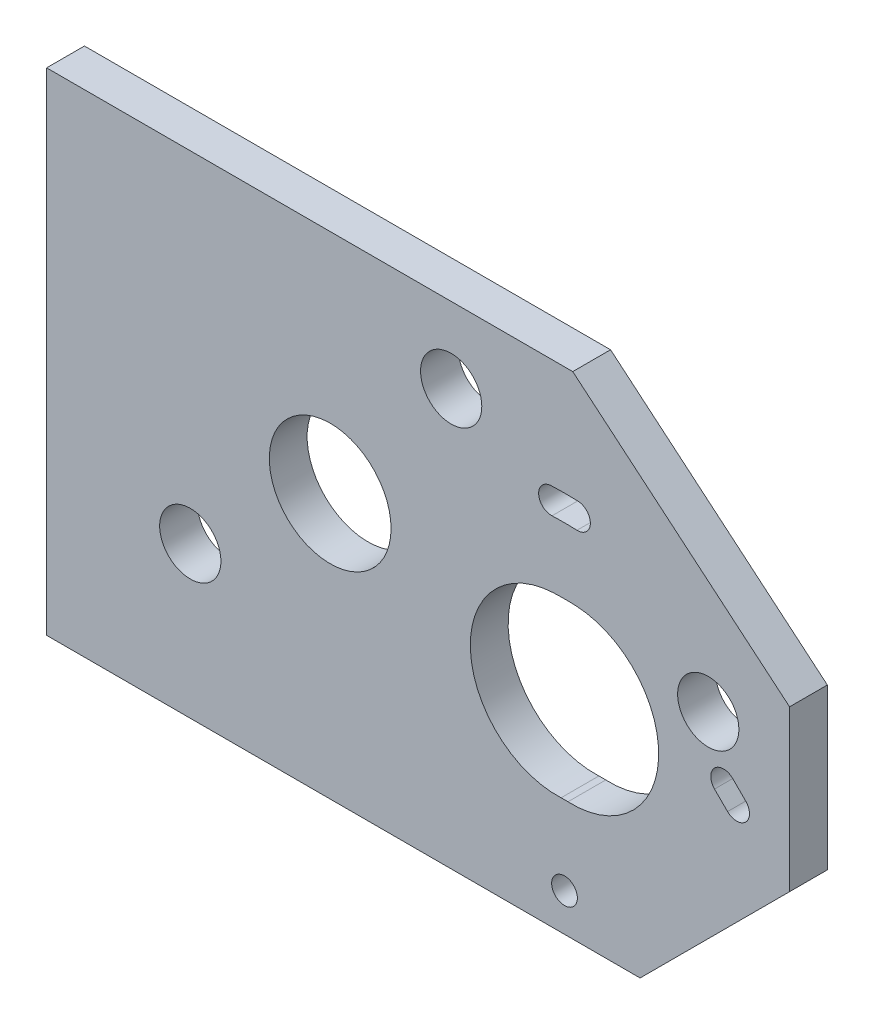
ISO-10303-21;
HEADER;
FILE_DESCRIPTION(('STEP AP214'),'2;1');
FILE_NAME('part.step','',(''),(''),'','','');
FILE_SCHEMA(('AUTOMOTIVE_DESIGN { 1 0 10303 214 1 1 1 1 }'));
ENDSEC;
DATA;
#1=APPLICATION_CONTEXT('core data for automotive mechanical design processes');
#2=APPLICATION_PROTOCOL_DEFINITION('international standard','automotive_design',2000,#1);
#3=PRODUCT_CONTEXT('',#1,'mechanical');
#4=PRODUCT('Part','Part','',(#3));
#5=PRODUCT_RELATED_PRODUCT_CATEGORY('part','',(#4));
#6=PRODUCT_DEFINITION_FORMATION('','',#4);
#7=PRODUCT_DEFINITION_CONTEXT('part definition',#1,'design');
#8=PRODUCT_DEFINITION('design','',#6,#7);
#9=PRODUCT_DEFINITION_SHAPE('','',#8);
#10=(LENGTH_UNIT() NAMED_UNIT(*) SI_UNIT(.MILLI.,.METRE.));
#11=(NAMED_UNIT(*) PLANE_ANGLE_UNIT() SI_UNIT($,.RADIAN.));
#12=(NAMED_UNIT(*) SI_UNIT($,.STERADIAN.) SOLID_ANGLE_UNIT());
#13=UNCERTAINTY_MEASURE_WITH_UNIT(LENGTH_MEASURE(1.E-05),#10,'distance_accuracy_value','');
#14=(GEOMETRIC_REPRESENTATION_CONTEXT(3) GLOBAL_UNCERTAINTY_ASSIGNED_CONTEXT((#13)) GLOBAL_UNIT_ASSIGNED_CONTEXT((#10,
#11,#12)) REPRESENTATION_CONTEXT('',''));
#15=CARTESIAN_POINT('',(0.,0.,0.));
#16=DIRECTION('',(0.,0.,1.));
#17=DIRECTION('',(1.,0.,0.));
#18=AXIS2_PLACEMENT_3D('',#15,#16,#17);
#19=CARTESIAN_POINT('',(0.,0.,5.));
#20=DIRECTION('',(0.,0.,-1.));
#21=DIRECTION('',(-1.,0.,0.));
#22=AXIS2_PLACEMENT_3D('',#19,#20,#21);
#23=PLANE('',#22);
#24=CARTESIAN_POINT('',(0.,0.,5.));
#25=DIRECTION('',(0.,0.,1.));
#26=DIRECTION('',(1.,0.,0.));
#27=AXIS2_PLACEMENT_3D('',#24,#25,#26);
#28=CIRCLE('',#27,8.05);
#29=CARTESIAN_POINT('',(8.05,0.,5.));
#30=VERTEX_POINT('',#29);
#31=EDGE_CURVE('E194',#30,#30,#28,.T.);
#32=ORIENTED_EDGE('',*,*,#31,.F.);
#33=EDGE_LOOP('',(#32));
#34=FACE_BOUND('',#33,.T.);
#35=CARTESIAN_POINT('',(30.987000641398,-30.,5.));
#36=DIRECTION('',(0.,0.,1.));
#37=DIRECTION('',(1.,0.,0.));
#38=AXIS2_PLACEMENT_3D('',#35,#36,#37);
#39=CIRCLE('',#38,1.69999999999998);
#40=CARTESIAN_POINT('',(32.687000641398,-30.,5.));
#41=VERTEX_POINT('',#40);
#42=EDGE_CURVE('E200',#41,#41,#39,.T.);
#43=ORIENTED_EDGE('',*,*,#42,.F.);
#44=EDGE_LOOP('',(#43));
#45=FACE_BOUND('',#44,.T.);
#46=CARTESIAN_POINT('',(29.2658110587049,13.8072001778298,5.));
#47=DIRECTION('',(0.,0.,1.));
#48=DIRECTION('',(1.,0.,0.));
#49=AXIS2_PLACEMENT_3D('',#46,#47,#48);
#50=CIRCLE('',#49,1.7);
#51=CARTESIAN_POINT('',(29.1990693719145,15.505889539439,5.));
#52=VERTEX_POINT('',#51);
#53=CARTESIAN_POINT('',(29.3325527454953,12.1085108162206,5.));
#54=VERTEX_POINT('',#53);
#55=EDGE_CURVE('E206',#52,#54,#50,.T.);
#56=ORIENTED_EDGE('',*,*,#55,.F.);
#57=CARTESIAN_POINT('',(30.987000641398,-30.,5.));
#58=DIRECTION('',(0.,0.,1.));
#59=DIRECTION('',(-1.,0.,0.));
#60=AXIS2_PLACEMENT_3D('',#57,#58,#59);
#61=CIRCLE('',#60,45.5410000000003);
#62=CARTESIAN_POINT('',(32.7749319108815,15.505889539439,5.));
#63=VERTEX_POINT('',#62);
#64=EDGE_CURVE('E214',#63,#52,#61,.T.);
#65=ORIENTED_EDGE('',*,*,#64,.F.);
#66=CARTESIAN_POINT('',(32.7081902240911,13.8072001778298,5.));
#67=DIRECTION('',(0.,0.,1.));
#68=DIRECTION('',(-1.,0.,0.));
#69=AXIS2_PLACEMENT_3D('',#66,#67,#68);
#70=CIRCLE('',#69,1.7);
#71=CARTESIAN_POINT('',(32.6414485373007,12.1085108162206,5.));
#72=VERTEX_POINT('',#71);
#73=EDGE_CURVE('E211',#72,#63,#70,.T.);
#74=ORIENTED_EDGE('',*,*,#73,.F.);
#75=CARTESIAN_POINT('',(30.987000641398,-30.,5.));
#76=DIRECTION('',(0.,0.,-1.));
#77=DIRECTION('',(-1.,0.,0.));
#78=AXIS2_PLACEMENT_3D('',#75,#76,#77);
#79=CIRCLE('',#78,42.1410000000002);
#80=EDGE_CURVE('E208',#54,#72,#79,.T.);
#81=ORIENTED_EDGE('',*,*,#80,.F.);
#82=EDGE_LOOP('',(#56,#65,#74,#81));
#83=FACE_BOUND('',#82,.T.);
#84=CARTESIAN_POINT('',(-18.5,-15.,5.));
#85=DIRECTION('',(0.,0.,1.));
#86=DIRECTION('',(1.,0.,0.));
#87=AXIS2_PLACEMENT_3D('',#84,#85,#86);
#88=CIRCLE('',#87,4.05);
#89=CARTESIAN_POINT('',(-14.45,-15.,5.));
#90=VERTEX_POINT('',#89);
#91=EDGE_CURVE('E268',#90,#90,#88,.T.);
#92=ORIENTED_EDGE('',*,*,#91,.F.);
#93=EDGE_LOOP('',(#92));
#94=FACE_BOUND('',#93,.T.);
#95=CARTESIAN_POINT('',(50.,0.,5.));
#96=DIRECTION('',(0.,0.,1.));
#97=DIRECTION('',(1.,0.,0.));
#98=AXIS2_PLACEMENT_3D('',#95,#96,#97);
#99=CIRCLE('',#98,4.05);
#100=CARTESIAN_POINT('',(54.05,0.,5.));
#101=VERTEX_POINT('',#100);
#102=EDGE_CURVE('E274',#101,#101,#99,.T.);
#103=ORIENTED_EDGE('',*,*,#102,.F.);
#104=EDGE_LOOP('',(#103));
#105=FACE_BOUND('',#104,.T.);
#106=CARTESIAN_POINT('',(16.,20.,5.));
#107=DIRECTION('',(0.,0.,1.));
#108=DIRECTION('',(1.,0.,0.));
#109=AXIS2_PLACEMENT_3D('',#106,#107,#108);
#110=CIRCLE('',#109,4.04999999999999);
#111=CARTESIAN_POINT('',(20.05,20.,5.));
#112=VERTEX_POINT('',#111);
#113=EDGE_CURVE('E280',#112,#112,#110,.T.);
#114=ORIENTED_EDGE('',*,*,#113,.F.);
#115=EDGE_LOOP('',(#114));
#116=FACE_BOUND('',#115,.T.);
#117=DIRECTION('',(-0.766044443118977,0.64278760968654,0.));
#118=VECTOR('',#117,1.);
#119=CARTESIAN_POINT('',(60.7512091401484,5.94120082025597,5.));
#120=LINE('',#119,#118);
#121=CARTESIAN_POINT('',(60.7512091401484,5.94120082025597,5.));
#122=VERTEX_POINT('',#121);
#123=CARTESIAN_POINT('',(32.0790487841859,30.,5.));
#124=VERTEX_POINT('',#123);
#125=EDGE_CURVE('E286',#122,#124,#120,.T.);
#126=ORIENTED_EDGE('',*,*,#125,.T.);
#127=DIRECTION('',(-1.,0.,0.));
#128=VECTOR('',#127,1.);
#129=CARTESIAN_POINT('',(32.0790487841859,30.,5.));
#130=LINE('',#129,#128);
#131=CARTESIAN_POINT('',(-37.5,30.,5.));
#132=VERTEX_POINT('',#131);
#133=EDGE_CURVE('E289',#124,#132,#130,.T.);
#134=ORIENTED_EDGE('',*,*,#133,.T.);
#135=DIRECTION('',(0.,-1.,0.));
#136=VECTOR('',#135,1.);
#137=CARTESIAN_POINT('',(-37.5,30.,5.));
#138=LINE('',#137,#136);
#139=CARTESIAN_POINT('',(-37.5,-35.,5.));
#140=VERTEX_POINT('',#139);
#141=EDGE_CURVE('E292',#132,#140,#138,.T.);
#142=ORIENTED_EDGE('',*,*,#141,.T.);
#143=DIRECTION('',(1.,0.,0.));
#144=VECTOR('',#143,1.);
#145=CARTESIAN_POINT('',(-37.5,-35.,5.));
#146=LINE('',#145,#144);
#147=CARTESIAN_POINT('',(40.987000641398,-35.,5.));
#148=VERTEX_POINT('',#147);
#149=EDGE_CURVE('E294',#140,#148,#146,.T.);
#150=ORIENTED_EDGE('',*,*,#149,.T.);
#151=DIRECTION('',(0.707106781186549,0.707106781186546,0.));
#152=VECTOR('',#151,1.);
#153=CARTESIAN_POINT('',(40.987000641398,-35.,5.));
#154=LINE('',#153,#152);
#155=CARTESIAN_POINT('',(60.7512091401484,-15.2357915012497,5.));
#156=VERTEX_POINT('',#155);
#157=EDGE_CURVE('E296',#148,#156,#154,.T.);
#158=ORIENTED_EDGE('',*,*,#157,.T.);
#159=DIRECTION('',(0.,1.,0.));
#160=VECTOR('',#159,1.);
#161=CARTESIAN_POINT('',(60.7512091401484,-15.2357915012497,5.));
#162=LINE('',#161,#160);
#163=EDGE_CURVE('E298',#156,#122,#162,.T.);
#164=ORIENTED_EDGE('',*,*,#163,.T.);
#165=EDGE_LOOP('',(#126,#134,#142,#150,#158,#164));
#166=FACE_BOUND('',#165,.T.);
#167=CARTESIAN_POINT('',(52.0297648200216,-7.23433528484822,5.));
#168=DIRECTION('',(0.,0.,1.));
#169=DIRECTION('',(-1.,0.,0.));
#170=AXIS2_PLACEMENT_3D('',#167,#168,#169);
#171=CIRCLE('',#170,1.7);
#172=CARTESIAN_POINT('',(53.2312289521742,-6.03163667790187,5.));
#173=VERTEX_POINT('',#172);
#174=CARTESIAN_POINT('',(50.8283006878689,-8.43703389179455,5.));
#175=VERTEX_POINT('',#174);
#176=EDGE_CURVE('E237',#173,#175,#171,.T.);
#177=ORIENTED_EDGE('',*,*,#176,.F.);
#178=DIRECTION('',(-0.707469768791964,0.706743607148621,0.));
#179=VECTOR('',#178,1.);
#180=CARTESIAN_POINT('',(53.2312289521742,-6.03163667790187,5.));
#181=LINE('',#180,#179);
#182=CARTESIAN_POINT('',(54.952673272301,-7.7513140718764,5.));
#183=VERTEX_POINT('',#182);
#184=EDGE_CURVE('E245',#183,#173,#181,.T.);
#185=ORIENTED_EDGE('',*,*,#184,.F.);
#186=CARTESIAN_POINT('',(53.7512091401484,-8.95401267882274,5.));
#187=DIRECTION('',(0.,0.,1.));
#188=DIRECTION('',(1.,0.,0.));
#189=AXIS2_PLACEMENT_3D('',#186,#187,#188);
#190=CIRCLE('',#189,1.7);
#191=CARTESIAN_POINT('',(52.5497450079957,-10.1567112857691,5.));
#192=VERTEX_POINT('',#191);
#193=EDGE_CURVE('E242',#192,#183,#190,.T.);
#194=ORIENTED_EDGE('',*,*,#193,.F.);
#195=DIRECTION('',(0.707469768791964,-0.706743607148621,0.));
#196=VECTOR('',#195,1.);
#197=CARTESIAN_POINT('',(52.5497450079957,-10.1567112857691,5.));
#198=LINE('',#197,#196);
#199=EDGE_CURVE('E239',#175,#192,#198,.T.);
#200=ORIENTED_EDGE('',*,*,#199,.F.);
#201=EDGE_LOOP('',(#177,#185,#194,#200));
#202=FACE_BOUND('',#201,.T.);
#203=CARTESIAN_POINT('',(30.0308418606563,-8.10036345881476,5.));
#204=DIRECTION('',(0.,0.,1.));
#205=DIRECTION('',(1.,0.,0.));
#206=AXIS2_PLACEMENT_3D('',#203,#204,#205);
#207=CIRCLE('',#206,11.5);
#208=CARTESIAN_POINT('',(29.5292189059549,3.38869108937662,5.));
#209=VERTEX_POINT('',#208);
#210=CARTESIAN_POINT('',(30.5324648153576,-19.5894180070061,5.));
#211=VERTEX_POINT('',#210);
#212=EDGE_CURVE('E158',#209,#211,#207,.T.);
#213=ORIENTED_EDGE('',*,*,#212,.F.);
#214=CARTESIAN_POINT('',(30.987000641398,-30.,5.));
#215=DIRECTION('',(0.,0.,1.));
#216=DIRECTION('',(-1.,0.,0.));
#217=AXIS2_PLACEMENT_3D('',#214,#215,#216);
#218=CIRCLE('',#217,33.4205000000001);
#219=CARTESIAN_POINT('',(32.4447823768411,3.38869108937662,5.));
#220=VERTEX_POINT('',#219);
#221=EDGE_CURVE('E180',#220,#209,#218,.T.);
#222=ORIENTED_EDGE('',*,*,#221,.F.);
#223=CARTESIAN_POINT('',(31.9431594221398,-8.10036345881476,5.));
#224=DIRECTION('',(0.,0.,1.));
#225=DIRECTION('',(-1.,0.,0.));
#226=AXIS2_PLACEMENT_3D('',#223,#224,#225);
#227=CIRCLE('',#226,11.5);
#228=CARTESIAN_POINT('',(31.4415364674385,-19.5894180070061,5.));
#229=VERTEX_POINT('',#228);
#230=EDGE_CURVE('E178',#229,#220,#227,.T.);
#231=ORIENTED_EDGE('',*,*,#230,.F.);
#232=CARTESIAN_POINT('',(30.987000641398,-30.,5.));
#233=DIRECTION('',(0.,0.,-1.));
#234=DIRECTION('',(-1.,0.,0.));
#235=AXIS2_PLACEMENT_3D('',#232,#233,#234);
#236=CIRCLE('',#235,10.4205000000001);
#237=EDGE_CURVE('E166',#211,#229,#236,.T.);
#238=ORIENTED_EDGE('',*,*,#237,.F.);
#239=EDGE_LOOP('',(#213,#222,#231,#238));
#240=FACE_BOUND('',#239,.T.);
#241=ADVANCED_FACE('F33',(#34,#45,#83,#94,#105,#116,#166,#202,#240),#23,.F.);
#242=CARTESIAN_POINT('',(0.,0.,0.));
#243=DIRECTION('',(0.,0.,-1.));
#244=DIRECTION('',(-1.,0.,0.));
#245=AXIS2_PLACEMENT_3D('',#242,#243,#244);
#246=PLANE('',#245);
#247=CARTESIAN_POINT('',(30.987000641398,-30.,0.));
#248=DIRECTION('',(0.,0.,1.));
#249=DIRECTION('',(1.,0.,0.));
#250=AXIS2_PLACEMENT_3D('',#247,#248,#249);
#251=CIRCLE('',#250,1.69999999999998);
#252=CARTESIAN_POINT('',(32.687000641398,-30.,0.));
#253=VERTEX_POINT('',#252);
#254=EDGE_CURVE('E197',#253,#253,#251,.T.);
#255=ORIENTED_EDGE('',*,*,#254,.T.);
#256=EDGE_LOOP('',(#255));
#257=FACE_BOUND('',#256,.T.);
#258=CARTESIAN_POINT('',(50.,0.,0.));
#259=DIRECTION('',(0.,0.,1.));
#260=DIRECTION('',(1.,0.,0.));
#261=AXIS2_PLACEMENT_3D('',#258,#259,#260);
#262=CIRCLE('',#261,4.05);
#263=CARTESIAN_POINT('',(54.05,0.,0.));
#264=VERTEX_POINT('',#263);
#265=EDGE_CURVE('E271',#264,#264,#262,.T.);
#266=ORIENTED_EDGE('',*,*,#265,.T.);
#267=EDGE_LOOP('',(#266));
#268=FACE_BOUND('',#267,.T.);
#269=DIRECTION('',(-0.766044443118977,0.64278760968654,0.));
#270=VECTOR('',#269,1.);
#271=CARTESIAN_POINT('',(60.7512091401484,5.94120082025597,0.));
#272=LINE('',#271,#270);
#273=CARTESIAN_POINT('',(60.7512091401484,5.94120082025597,0.));
#274=VERTEX_POINT('',#273);
#275=CARTESIAN_POINT('',(32.0790487841859,30.,0.));
#276=VERTEX_POINT('',#275);
#277=EDGE_CURVE('E283',#274,#276,#272,.T.);
#278=ORIENTED_EDGE('',*,*,#277,.F.);
#279=DIRECTION('',(0.,1.,0.));
#280=VECTOR('',#279,1.);
#281=CARTESIAN_POINT('',(60.7512091401484,-15.2357915012497,0.));
#282=LINE('',#281,#280);
#283=CARTESIAN_POINT('',(60.7512091401484,-15.2357915012497,0.));
#284=VERTEX_POINT('',#283);
#285=EDGE_CURVE('E290',#284,#274,#282,.T.);
#286=ORIENTED_EDGE('',*,*,#285,.F.);
#287=DIRECTION('',(0.707106781186549,0.707106781186546,0.));
#288=VECTOR('',#287,1.);
#289=CARTESIAN_POINT('',(40.987000641398,-35.,0.));
#290=LINE('',#289,#288);
#291=CARTESIAN_POINT('',(40.987000641398,-35.,0.));
#292=VERTEX_POINT('',#291);
#293=EDGE_CURVE('E309',#292,#284,#290,.T.);
#294=ORIENTED_EDGE('',*,*,#293,.F.);
#295=DIRECTION('',(1.,0.,0.));
#296=VECTOR('',#295,1.);
#297=CARTESIAN_POINT('',(-37.5,-35.,0.));
#298=LINE('',#297,#296);
#299=CARTESIAN_POINT('',(-37.5,-35.,0.));
#300=VERTEX_POINT('',#299);
#301=EDGE_CURVE('E307',#300,#292,#298,.T.);
#302=ORIENTED_EDGE('',*,*,#301,.F.);
#303=DIRECTION('',(0.,-1.,0.));
#304=VECTOR('',#303,1.);
#305=CARTESIAN_POINT('',(-37.5,30.,0.));
#306=LINE('',#305,#304);
#307=CARTESIAN_POINT('',(-37.5,30.,0.));
#308=VERTEX_POINT('',#307);
#309=EDGE_CURVE('E305',#308,#300,#306,.T.);
#310=ORIENTED_EDGE('',*,*,#309,.F.);
#311=DIRECTION('',(-1.,0.,0.));
#312=VECTOR('',#311,1.);
#313=CARTESIAN_POINT('',(32.0790487841859,30.,0.));
#314=LINE('',#313,#312);
#315=EDGE_CURVE('E303',#276,#308,#314,.T.);
#316=ORIENTED_EDGE('',*,*,#315,.F.);
#317=EDGE_LOOP('',(#278,#286,#294,#302,#310,#316));
#318=FACE_BOUND('',#317,.T.);
#319=CARTESIAN_POINT('',(16.,20.,0.));
#320=DIRECTION('',(0.,0.,1.));
#321=DIRECTION('',(1.,0.,0.));
#322=AXIS2_PLACEMENT_3D('',#319,#320,#321);
#323=CIRCLE('',#322,4.04999999999999);
#324=CARTESIAN_POINT('',(20.05,20.,0.));
#325=VERTEX_POINT('',#324);
#326=EDGE_CURVE('E277',#325,#325,#323,.T.);
#327=ORIENTED_EDGE('',*,*,#326,.T.);
#328=EDGE_LOOP('',(#327));
#329=FACE_BOUND('',#328,.T.);
#330=CARTESIAN_POINT('',(-18.5,-15.,0.));
#331=DIRECTION('',(0.,0.,1.));
#332=DIRECTION('',(1.,0.,0.));
#333=AXIS2_PLACEMENT_3D('',#330,#331,#332);
#334=CIRCLE('',#333,4.05);
#335=CARTESIAN_POINT('',(-14.45,-15.,0.));
#336=VERTEX_POINT('',#335);
#337=EDGE_CURVE('E267',#336,#336,#334,.T.);
#338=ORIENTED_EDGE('',*,*,#337,.T.);
#339=EDGE_LOOP('',(#338));
#340=FACE_BOUND('',#339,.T.);
#341=DIRECTION('',(-0.707469768791964,0.706743607148621,0.));
#342=VECTOR('',#341,1.);
#343=CARTESIAN_POINT('',(53.2312289521742,-6.03163667790187,0.));
#344=LINE('',#343,#342);
#345=CARTESIAN_POINT('',(54.952673272301,-7.7513140718764,0.));
#346=VERTEX_POINT('',#345);
#347=CARTESIAN_POINT('',(53.2312289521742,-6.03163667790187,0.));
#348=VERTEX_POINT('',#347);
#349=EDGE_CURVE('E240',#346,#348,#344,.T.);
#350=ORIENTED_EDGE('',*,*,#349,.T.);
#351=CARTESIAN_POINT('',(52.0297648200216,-7.23433528484822,0.));
#352=DIRECTION('',(0.,0.,1.));
#353=DIRECTION('',(-1.,0.,0.));
#354=AXIS2_PLACEMENT_3D('',#351,#352,#353);
#355=CIRCLE('',#354,1.7);
#356=CARTESIAN_POINT('',(50.8283006878689,-8.43703389179455,0.));
#357=VERTEX_POINT('',#356);
#358=EDGE_CURVE('E236',#348,#357,#355,.T.);
#359=ORIENTED_EDGE('',*,*,#358,.T.);
#360=DIRECTION('',(0.707469768791964,-0.706743607148621,0.));
#361=VECTOR('',#360,1.);
#362=CARTESIAN_POINT('',(52.5497450079957,-10.1567112857691,0.));
#363=LINE('',#362,#361);
#364=CARTESIAN_POINT('',(52.5497450079957,-10.1567112857691,0.));
#365=VERTEX_POINT('',#364);
#366=EDGE_CURVE('E250',#357,#365,#363,.T.);
#367=ORIENTED_EDGE('',*,*,#366,.T.);
#368=CARTESIAN_POINT('',(53.7512091401484,-8.95401267882274,0.));
#369=DIRECTION('',(0.,0.,1.));
#370=DIRECTION('',(1.,0.,0.));
#371=AXIS2_PLACEMENT_3D('',#368,#369,#370);
#372=CIRCLE('',#371,1.7);
#373=EDGE_CURVE('E253',#365,#346,#372,.T.);
#374=ORIENTED_EDGE('',*,*,#373,.T.);
#375=EDGE_LOOP('',(#350,#359,#367,#374));
#376=FACE_BOUND('',#375,.T.);
#377=CARTESIAN_POINT('',(30.987000641398,-30.,0.));
#378=DIRECTION('',(0.,0.,1.));
#379=DIRECTION('',(-1.,0.,0.));
#380=AXIS2_PLACEMENT_3D('',#377,#378,#379);
#381=CIRCLE('',#380,45.5410000000003);
#382=CARTESIAN_POINT('',(32.7749319108815,15.505889539439,0.));
#383=VERTEX_POINT('',#382);
#384=CARTESIAN_POINT('',(29.1990693719145,15.505889539439,0.));
#385=VERTEX_POINT('',#384);
#386=EDGE_CURVE('E209',#383,#385,#381,.T.);
#387=ORIENTED_EDGE('',*,*,#386,.T.);
#388=CARTESIAN_POINT('',(29.2658110587049,13.8072001778298,0.));
#389=DIRECTION('',(0.,0.,1.));
#390=DIRECTION('',(1.,0.,0.));
#391=AXIS2_PLACEMENT_3D('',#388,#389,#390);
#392=CIRCLE('',#391,1.7);
#393=CARTESIAN_POINT('',(29.3325527454953,12.1085108162206,0.));
#394=VERTEX_POINT('',#393);
#395=EDGE_CURVE('E203',#385,#394,#392,.T.);
#396=ORIENTED_EDGE('',*,*,#395,.T.);
#397=CARTESIAN_POINT('',(30.987000641398,-30.,0.));
#398=DIRECTION('',(0.,0.,-1.));
#399=DIRECTION('',(-1.,0.,0.));
#400=AXIS2_PLACEMENT_3D('',#397,#398,#399);
#401=CIRCLE('',#400,42.1410000000002);
#402=CARTESIAN_POINT('',(32.6414485373007,12.1085108162206,0.));
#403=VERTEX_POINT('',#402);
#404=EDGE_CURVE('E219',#394,#403,#401,.T.);
#405=ORIENTED_EDGE('',*,*,#404,.T.);
#406=CARTESIAN_POINT('',(32.7081902240911,13.8072001778298,0.));
#407=DIRECTION('',(0.,0.,1.));
#408=DIRECTION('',(-1.,0.,0.));
#409=AXIS2_PLACEMENT_3D('',#406,#407,#408);
#410=CIRCLE('',#409,1.7);
#411=EDGE_CURVE('E222',#403,#383,#410,.T.);
#412=ORIENTED_EDGE('',*,*,#411,.T.);
#413=EDGE_LOOP('',(#387,#396,#405,#412));
#414=FACE_BOUND('',#413,.T.);
#415=CARTESIAN_POINT('',(0.,0.,0.));
#416=DIRECTION('',(0.,0.,1.));
#417=DIRECTION('',(1.,0.,0.));
#418=AXIS2_PLACEMENT_3D('',#415,#416,#417);
#419=CIRCLE('',#418,8.05);
#420=CARTESIAN_POINT('',(8.05,0.,0.));
#421=VERTEX_POINT('',#420);
#422=EDGE_CURVE('E174',#421,#421,#419,.T.);
#423=ORIENTED_EDGE('',*,*,#422,.T.);
#424=EDGE_LOOP('',(#423));
#425=FACE_BOUND('',#424,.T.);
#426=CARTESIAN_POINT('',(30.987000641398,-30.,0.));
#427=DIRECTION('',(0.,0.,1.));
#428=DIRECTION('',(-1.,0.,0.));
#429=AXIS2_PLACEMENT_3D('',#426,#427,#428);
#430=CIRCLE('',#429,33.4205000000001);
#431=CARTESIAN_POINT('',(32.4447823768411,3.38869108937662,0.));
#432=VERTEX_POINT('',#431);
#433=CARTESIAN_POINT('',(29.5292189059549,3.38869108937662,0.));
#434=VERTEX_POINT('',#433);
#435=EDGE_CURVE('E167',#432,#434,#430,.T.);
#436=ORIENTED_EDGE('',*,*,#435,.T.);
#437=CARTESIAN_POINT('',(30.0308418606563,-8.10036345881476,0.));
#438=DIRECTION('',(0.,0.,1.));
#439=DIRECTION('',(1.,0.,0.));
#440=AXIS2_PLACEMENT_3D('',#437,#438,#439);
#441=CIRCLE('',#440,11.5);
#442=CARTESIAN_POINT('',(30.5324648153576,-19.5894180070061,0.));
#443=VERTEX_POINT('',#442);
#444=EDGE_CURVE('E56',#434,#443,#441,.T.);
#445=ORIENTED_EDGE('',*,*,#444,.T.);
#446=CARTESIAN_POINT('',(30.987000641398,-30.,0.));
#447=DIRECTION('',(0.,0.,-1.));
#448=DIRECTION('',(-1.,0.,0.));
#449=AXIS2_PLACEMENT_3D('',#446,#447,#448);
#450=CIRCLE('',#449,10.4205000000001);
#451=CARTESIAN_POINT('',(31.4415364674385,-19.5894180070061,0.));
#452=VERTEX_POINT('',#451);
#453=EDGE_CURVE('E173',#443,#452,#450,.T.);
#454=ORIENTED_EDGE('',*,*,#453,.T.);
#455=CARTESIAN_POINT('',(31.9431594221398,-8.10036345881476,0.));
#456=DIRECTION('',(0.,0.,1.));
#457=DIRECTION('',(-1.,0.,0.));
#458=AXIS2_PLACEMENT_3D('',#455,#456,#457);
#459=CIRCLE('',#458,11.5);
#460=EDGE_CURVE('E186',#452,#432,#459,.T.);
#461=ORIENTED_EDGE('',*,*,#460,.T.);
#462=EDGE_LOOP('',(#436,#445,#454,#461));
#463=FACE_BOUND('',#462,.T.);
#464=ADVANCED_FACE('F333',(#257,#268,#318,#329,#340,#376,#414,#425,#463),#246,.T.);
#465=CARTESIAN_POINT('',(60.7512091401484,5.94120082025597,5.));
#466=DIRECTION('',(-0.64278760968654,-0.766044443118977,0.));
#467=DIRECTION('',(0.766044443118977,-0.64278760968654,0.));
#468=AXIS2_PLACEMENT_3D('',#465,#466,#467);
#469=PLANE('',#468);
#470=ORIENTED_EDGE('',*,*,#277,.T.);
#471=DIRECTION('',(0.,0.,-1.));
#472=VECTOR('',#471,1.);
#473=CARTESIAN_POINT('',(32.0790487841859,30.,5.));
#474=LINE('',#473,#472);
#475=EDGE_CURVE('E11',#124,#276,#474,.T.);
#476=ORIENTED_EDGE('',*,*,#475,.F.);
#477=ORIENTED_EDGE('',*,*,#125,.F.);
#478=DIRECTION('',(0.,0.,-1.));
#479=VECTOR('',#478,1.);
#480=CARTESIAN_POINT('',(60.7512091401484,5.94120082025597,5.));
#481=LINE('',#480,#479);
#482=EDGE_CURVE('E300',#122,#274,#481,.T.);
#483=ORIENTED_EDGE('',*,*,#482,.T.);
#484=EDGE_LOOP('',(#470,#476,#477,#483));
#485=FACE_BOUND('',#484,.T.);
#486=ADVANCED_FACE('F35',(#485),#469,.F.);
#487=CARTESIAN_POINT('',(32.0790487841859,30.,5.));
#488=DIRECTION('',(0.,-1.,0.));
#489=DIRECTION('',(1.,0.,0.));
#490=AXIS2_PLACEMENT_3D('',#487,#488,#489);
#491=PLANE('',#490);
#492=ORIENTED_EDGE('',*,*,#315,.T.);
#493=DIRECTION('',(0.,0.,-1.));
#494=VECTOR('',#493,1.);
#495=CARTESIAN_POINT('',(-37.5,30.,5.));
#496=LINE('',#495,#494);
#497=EDGE_CURVE('E41',#132,#308,#496,.T.);
#498=ORIENTED_EDGE('',*,*,#497,.F.);
#499=ORIENTED_EDGE('',*,*,#133,.F.);
#500=ORIENTED_EDGE('',*,*,#475,.T.);
#501=EDGE_LOOP('',(#492,#498,#499,#500));
#502=FACE_BOUND('',#501,.T.);
#503=ADVANCED_FACE('F351',(#502),#491,.F.);
#504=CARTESIAN_POINT('',(-37.5,30.,5.));
#505=DIRECTION('',(1.,0.,0.));
#506=DIRECTION('',(0.,1.,0.));
#507=AXIS2_PLACEMENT_3D('',#504,#505,#506);
#508=PLANE('',#507);
#509=ORIENTED_EDGE('',*,*,#309,.T.);
#510=DIRECTION('',(0.,0.,-1.));
#511=VECTOR('',#510,1.);
#512=CARTESIAN_POINT('',(-37.5,-35.,5.));
#513=LINE('',#512,#511);
#514=EDGE_CURVE('E320',#140,#300,#513,.T.);
#515=ORIENTED_EDGE('',*,*,#514,.F.);
#516=ORIENTED_EDGE('',*,*,#141,.F.);
#517=ORIENTED_EDGE('',*,*,#497,.T.);
#518=EDGE_LOOP('',(#509,#515,#516,#517));
#519=FACE_BOUND('',#518,.T.);
#520=ADVANCED_FACE('F327',(#519),#508,.F.);
#521=CARTESIAN_POINT('',(-37.5,-35.,5.));
#522=DIRECTION('',(0.,1.,0.));
#523=DIRECTION('',(0.,0.,1.));
#524=AXIS2_PLACEMENT_3D('',#521,#522,#523);
#525=PLANE('',#524);
#526=ORIENTED_EDGE('',*,*,#301,.T.);
#527=DIRECTION('',(0.,0.,-1.));
#528=VECTOR('',#527,1.);
#529=CARTESIAN_POINT('',(40.987000641398,-35.,5.));
#530=LINE('',#529,#528);
#531=EDGE_CURVE('E317',#148,#292,#530,.T.);
#532=ORIENTED_EDGE('',*,*,#531,.F.);
#533=ORIENTED_EDGE('',*,*,#149,.F.);
#534=ORIENTED_EDGE('',*,*,#514,.T.);
#535=EDGE_LOOP('',(#526,#532,#533,#534));
#536=FACE_BOUND('',#535,.T.);
#537=ADVANCED_FACE('F339',(#536),#525,.F.);
#538=CARTESIAN_POINT('',(40.987000641398,-35.,5.));
#539=DIRECTION('',(-0.707106781186546,0.707106781186549,0.));
#540=DIRECTION('',(-0.707106781186549,-0.707106781186546,0.));
#541=AXIS2_PLACEMENT_3D('',#538,#539,#540);
#542=PLANE('',#541);
#543=ORIENTED_EDGE('',*,*,#293,.T.);
#544=DIRECTION('',(0.,0.,-1.));
#545=VECTOR('',#544,1.);
#546=CARTESIAN_POINT('',(60.7512091401484,-15.2357915012497,5.));
#547=LINE('',#546,#545);
#548=EDGE_CURVE('E314',#156,#284,#547,.T.);
#549=ORIENTED_EDGE('',*,*,#548,.F.);
#550=ORIENTED_EDGE('',*,*,#157,.F.);
#551=ORIENTED_EDGE('',*,*,#531,.T.);
#552=EDGE_LOOP('',(#543,#549,#550,#551));
#553=FACE_BOUND('',#552,.T.);
#554=ADVANCED_FACE('F343',(#553),#542,.F.);
#555=CARTESIAN_POINT('',(60.7512091401484,-15.2357915012497,5.));
#556=DIRECTION('',(-1.,0.,0.));
#557=DIRECTION('',(0.,0.,1.));
#558=AXIS2_PLACEMENT_3D('',#555,#556,#557);
#559=PLANE('',#558);
#560=ORIENTED_EDGE('',*,*,#285,.T.);
#561=ORIENTED_EDGE('',*,*,#482,.F.);
#562=ORIENTED_EDGE('',*,*,#163,.F.);
#563=ORIENTED_EDGE('',*,*,#548,.T.);
#564=EDGE_LOOP('',(#560,#561,#562,#563));
#565=FACE_BOUND('',#564,.T.);
#566=ADVANCED_FACE('F354',(#565),#559,.F.);
#567=CARTESIAN_POINT('',(16.,20.,5.));
#568=DIRECTION('',(0.,0.,-1.));
#569=DIRECTION('',(-1.,0.,0.));
#570=AXIS2_PLACEMENT_3D('',#567,#568,#569);
#571=CYLINDRICAL_SURFACE('',#570,4.04999999999999);
#572=ORIENTED_EDGE('',*,*,#113,.T.);
#573=EDGE_LOOP('',(#572));
#574=FACE_BOUND('',#573,.T.);
#575=ORIENTED_EDGE('',*,*,#326,.F.);
#576=EDGE_LOOP('',(#575));
#577=FACE_BOUND('',#576,.T.);
#578=ADVANCED_FACE('F356',(#574,#577),#571,.F.);
#579=CARTESIAN_POINT('',(50.,0.,5.));
#580=DIRECTION('',(0.,0.,-1.));
#581=DIRECTION('',(-1.,0.,0.));
#582=AXIS2_PLACEMENT_3D('',#579,#580,#581);
#583=CYLINDRICAL_SURFACE('',#582,4.05);
#584=ORIENTED_EDGE('',*,*,#102,.T.);
#585=EDGE_LOOP('',(#584));
#586=FACE_BOUND('',#585,.T.);
#587=ORIENTED_EDGE('',*,*,#265,.F.);
#588=EDGE_LOOP('',(#587));
#589=FACE_BOUND('',#588,.T.);
#590=ADVANCED_FACE('F362',(#586,#589),#583,.F.);
#591=CARTESIAN_POINT('',(-18.5,-15.,5.));
#592=DIRECTION('',(0.,0.,-1.));
#593=DIRECTION('',(-1.,0.,0.));
#594=AXIS2_PLACEMENT_3D('',#591,#592,#593);
#595=CYLINDRICAL_SURFACE('',#594,4.05);
#596=ORIENTED_EDGE('',*,*,#91,.T.);
#597=EDGE_LOOP('',(#596));
#598=FACE_BOUND('',#597,.T.);
#599=ORIENTED_EDGE('',*,*,#337,.F.);
#600=EDGE_LOOP('',(#599));
#601=FACE_BOUND('',#600,.T.);
#602=ADVANCED_FACE('F379',(#598,#601),#595,.F.);
#603=CARTESIAN_POINT('',(52.0297648200216,-7.23433528484822,5.));
#604=DIRECTION('',(0.,0.,-1.));
#605=DIRECTION('',(-1.,0.,0.));
#606=AXIS2_PLACEMENT_3D('',#603,#604,#605);
#607=CYLINDRICAL_SURFACE('',#606,1.7);
#608=ORIENTED_EDGE('',*,*,#358,.F.);
#609=DIRECTION('',(0.,0.,-1.));
#610=VECTOR('',#609,1.);
#611=CARTESIAN_POINT('',(53.2312289521742,-6.03163667790187,5.));
#612=LINE('',#611,#610);
#613=EDGE_CURVE('E247',#173,#348,#612,.T.);
#614=ORIENTED_EDGE('',*,*,#613,.F.);
#615=ORIENTED_EDGE('',*,*,#176,.T.);
#616=DIRECTION('',(0.,0.,-1.));
#617=VECTOR('',#616,1.);
#618=CARTESIAN_POINT('',(50.8283006878689,-8.43703389179455,5.));
#619=LINE('',#618,#617);
#620=EDGE_CURVE('E264',#175,#357,#619,.T.);
#621=ORIENTED_EDGE('',*,*,#620,.T.);
#622=EDGE_LOOP('',(#608,#614,#615,#621));
#623=FACE_BOUND('',#622,.T.);
#624=ADVANCED_FACE('F383',(#623),#607,.F.);
#625=CARTESIAN_POINT('',(52.5497450079957,-10.1567112857691,5.));
#626=DIRECTION('',(0.706743607148621,0.707469768791964,0.));
#627=DIRECTION('',(-0.707469768791964,0.706743607148621,0.));
#628=AXIS2_PLACEMENT_3D('',#625,#626,#627);
#629=PLANE('',#628);
#630=ORIENTED_EDGE('',*,*,#366,.F.);
#631=ORIENTED_EDGE('',*,*,#620,.F.);
#632=ORIENTED_EDGE('',*,*,#199,.T.);
#633=DIRECTION('',(0.,0.,-1.));
#634=VECTOR('',#633,1.);
#635=CARTESIAN_POINT('',(52.5497450079957,-10.1567112857691,5.));
#636=LINE('',#635,#634);
#637=EDGE_CURVE('E262',#192,#365,#636,.T.);
#638=ORIENTED_EDGE('',*,*,#637,.T.);
#639=EDGE_LOOP('',(#630,#631,#632,#638));
#640=FACE_BOUND('',#639,.T.);
#641=ADVANCED_FACE('F387',(#640),#629,.T.);
#642=CARTESIAN_POINT('',(53.7512091401484,-8.95401267882274,5.));
#643=DIRECTION('',(0.,0.,-1.));
#644=DIRECTION('',(-1.,0.,0.));
#645=AXIS2_PLACEMENT_3D('',#642,#643,#644);
#646=CYLINDRICAL_SURFACE('',#645,1.7);
#647=ORIENTED_EDGE('',*,*,#373,.F.);
#648=ORIENTED_EDGE('',*,*,#637,.F.);
#649=ORIENTED_EDGE('',*,*,#193,.T.);
#650=DIRECTION('',(0.,0.,-1.));
#651=VECTOR('',#650,1.);
#652=CARTESIAN_POINT('',(54.952673272301,-7.7513140718764,5.));
#653=LINE('',#652,#651);
#654=EDGE_CURVE('E260',#183,#346,#653,.T.);
#655=ORIENTED_EDGE('',*,*,#654,.T.);
#656=EDGE_LOOP('',(#647,#648,#649,#655));
#657=FACE_BOUND('',#656,.T.);
#658=ADVANCED_FACE('F391',(#657),#646,.F.);
#659=CARTESIAN_POINT('',(53.2312289521742,-6.03163667790187,5.));
#660=DIRECTION('',(-0.706743607148621,-0.707469768791964,0.));
#661=DIRECTION('',(0.707469768791964,-0.706743607148621,0.));
#662=AXIS2_PLACEMENT_3D('',#659,#660,#661);
#663=PLANE('',#662);
#664=ORIENTED_EDGE('',*,*,#349,.F.);
#665=ORIENTED_EDGE('',*,*,#654,.F.);
#666=ORIENTED_EDGE('',*,*,#184,.T.);
#667=ORIENTED_EDGE('',*,*,#613,.T.);
#668=EDGE_LOOP('',(#664,#665,#666,#667));
#669=FACE_BOUND('',#668,.T.);
#670=ADVANCED_FACE('F395',(#669),#663,.T.);
#671=CARTESIAN_POINT('',(29.2658110587049,13.8072001778298,5.));
#672=DIRECTION('',(0.,0.,-1.));
#673=DIRECTION('',(-1.,0.,0.));
#674=AXIS2_PLACEMENT_3D('',#671,#672,#673);
#675=CYLINDRICAL_SURFACE('',#674,1.7);
#676=ORIENTED_EDGE('',*,*,#395,.F.);
#677=DIRECTION('',(0.,0.,-1.));
#678=VECTOR('',#677,1.);
#679=CARTESIAN_POINT('',(29.1990693719145,15.505889539439,5.));
#680=LINE('',#679,#678);
#681=EDGE_CURVE('E216',#52,#385,#680,.T.);
#682=ORIENTED_EDGE('',*,*,#681,.F.);
#683=ORIENTED_EDGE('',*,*,#55,.T.);
#684=DIRECTION('',(0.,0.,-1.));
#685=VECTOR('',#684,1.);
#686=CARTESIAN_POINT('',(29.3325527454953,12.1085108162206,5.));
#687=LINE('',#686,#685);
#688=EDGE_CURVE('E233',#54,#394,#687,.T.);
#689=ORIENTED_EDGE('',*,*,#688,.T.);
#690=EDGE_LOOP('',(#676,#682,#683,#689));
#691=FACE_BOUND('',#690,.T.);
#692=ADVANCED_FACE('F399',(#691),#675,.F.);
#693=CARTESIAN_POINT('',(30.987000641398,-30.,5.));
#694=DIRECTION('',(0.,0.,-1.));
#695=DIRECTION('',(-1.,0.,0.));
#696=AXIS2_PLACEMENT_3D('',#693,#694,#695);
#697=CYLINDRICAL_SURFACE('',#696,42.1410000000002);
#698=ORIENTED_EDGE('',*,*,#404,.F.);
#699=ORIENTED_EDGE('',*,*,#688,.F.);
#700=ORIENTED_EDGE('',*,*,#80,.T.);
#701=DIRECTION('',(0.,0.,-1.));
#702=VECTOR('',#701,1.);
#703=CARTESIAN_POINT('',(32.6414485373007,12.1085108162206,5.));
#704=LINE('',#703,#702);
#705=EDGE_CURVE('E231',#72,#403,#704,.T.);
#706=ORIENTED_EDGE('',*,*,#705,.T.);
#707=EDGE_LOOP('',(#698,#699,#700,#706));
#708=FACE_BOUND('',#707,.T.);
#709=ADVANCED_FACE('F403',(#708),#697,.T.);
#710=CARTESIAN_POINT('',(32.7081902240911,13.8072001778298,5.));
#711=DIRECTION('',(0.,0.,-1.));
#712=DIRECTION('',(-1.,0.,0.));
#713=AXIS2_PLACEMENT_3D('',#710,#711,#712);
#714=CYLINDRICAL_SURFACE('',#713,1.7);
#715=ORIENTED_EDGE('',*,*,#411,.F.);
#716=ORIENTED_EDGE('',*,*,#705,.F.);
#717=ORIENTED_EDGE('',*,*,#73,.T.);
#718=DIRECTION('',(0.,0.,-1.));
#719=VECTOR('',#718,1.);
#720=CARTESIAN_POINT('',(32.7749319108815,15.505889539439,5.));
#721=LINE('',#720,#719);
#722=EDGE_CURVE('E229',#63,#383,#721,.T.);
#723=ORIENTED_EDGE('',*,*,#722,.T.);
#724=EDGE_LOOP('',(#715,#716,#717,#723));
#725=FACE_BOUND('',#724,.T.);
#726=ADVANCED_FACE('F407',(#725),#714,.F.);
#727=CARTESIAN_POINT('',(30.987000641398,-30.,5.));
#728=DIRECTION('',(0.,0.,-1.));
#729=DIRECTION('',(-1.,0.,0.));
#730=AXIS2_PLACEMENT_3D('',#727,#728,#729);
#731=CYLINDRICAL_SURFACE('',#730,45.5410000000003);
#732=ORIENTED_EDGE('',*,*,#386,.F.);
#733=ORIENTED_EDGE('',*,*,#722,.F.);
#734=ORIENTED_EDGE('',*,*,#64,.T.);
#735=ORIENTED_EDGE('',*,*,#681,.T.);
#736=EDGE_LOOP('',(#732,#733,#734,#735));
#737=FACE_BOUND('',#736,.T.);
#738=ADVANCED_FACE('F411',(#737),#731,.F.);
#739=CARTESIAN_POINT('',(30.987000641398,-30.,5.));
#740=DIRECTION('',(0.,0.,-1.));
#741=DIRECTION('',(-1.,0.,0.));
#742=AXIS2_PLACEMENT_3D('',#739,#740,#741);
#743=CYLINDRICAL_SURFACE('',#742,1.69999999999998);
#744=ORIENTED_EDGE('',*,*,#42,.T.);
#745=EDGE_LOOP('',(#744));
#746=FACE_BOUND('',#745,.T.);
#747=ORIENTED_EDGE('',*,*,#254,.F.);
#748=EDGE_LOOP('',(#747));
#749=FACE_BOUND('',#748,.T.);
#750=ADVANCED_FACE('F415',(#746,#749),#743,.F.);
#751=CARTESIAN_POINT('',(0.,0.,5.));
#752=DIRECTION('',(0.,0.,-1.));
#753=DIRECTION('',(-1.,0.,0.));
#754=AXIS2_PLACEMENT_3D('',#751,#752,#753);
#755=CYLINDRICAL_SURFACE('',#754,8.05);
#756=ORIENTED_EDGE('',*,*,#31,.T.);
#757=EDGE_LOOP('',(#756));
#758=FACE_BOUND('',#757,.T.);
#759=ORIENTED_EDGE('',*,*,#422,.F.);
#760=EDGE_LOOP('',(#759));
#761=FACE_BOUND('',#760,.T.);
#762=ADVANCED_FACE('F419',(#758,#761),#755,.F.);
#763=CARTESIAN_POINT('',(30.0308418606563,-8.10036345881476,5.));
#764=DIRECTION('',(0.,0.,-1.));
#765=DIRECTION('',(-1.,0.,0.));
#766=AXIS2_PLACEMENT_3D('',#763,#764,#765);
#767=CYLINDRICAL_SURFACE('',#766,11.5);
#768=ORIENTED_EDGE('',*,*,#444,.F.);
#769=DIRECTION('',(0.,0.,-1.));
#770=VECTOR('',#769,1.);
#771=CARTESIAN_POINT('',(29.5292189059549,3.38869108937662,5.));
#772=LINE('',#771,#770);
#773=EDGE_CURVE('E162',#209,#434,#772,.T.);
#774=ORIENTED_EDGE('',*,*,#773,.F.);
#775=ORIENTED_EDGE('',*,*,#212,.T.);
#776=DIRECTION('',(0.,0.,-1.));
#777=VECTOR('',#776,1.);
#778=CARTESIAN_POINT('',(30.5324648153576,-19.5894180070061,5.));
#779=LINE('',#778,#777);
#780=EDGE_CURVE('E161',#211,#443,#779,.T.);
#781=ORIENTED_EDGE('',*,*,#780,.T.);
#782=EDGE_LOOP('',(#768,#774,#775,#781));
#783=FACE_BOUND('',#782,.T.);
#784=ADVANCED_FACE('F160',(#783),#767,.F.);
#785=CARTESIAN_POINT('',(30.987000641398,-30.,5.));
#786=DIRECTION('',(0.,0.,-1.));
#787=DIRECTION('',(-1.,0.,0.));
#788=AXIS2_PLACEMENT_3D('',#785,#786,#787);
#789=CYLINDRICAL_SURFACE('',#788,10.4205000000001);
#790=ORIENTED_EDGE('',*,*,#453,.F.);
#791=ORIENTED_EDGE('',*,*,#780,.F.);
#792=ORIENTED_EDGE('',*,*,#237,.T.);
#793=DIRECTION('',(0.,0.,-1.));
#794=VECTOR('',#793,1.);
#795=CARTESIAN_POINT('',(31.4415364674385,-19.5894180070061,5.));
#796=LINE('',#795,#794);
#797=EDGE_CURVE('E175',#229,#452,#796,.T.);
#798=ORIENTED_EDGE('',*,*,#797,.T.);
#799=EDGE_LOOP('',(#790,#791,#792,#798));
#800=FACE_BOUND('',#799,.T.);
#801=ADVANCED_FACE('F170',(#800),#789,.T.);
#802=CARTESIAN_POINT('',(31.9431594221398,-8.10036345881476,5.));
#803=DIRECTION('',(0.,0.,-1.));
#804=DIRECTION('',(-1.,0.,0.));
#805=AXIS2_PLACEMENT_3D('',#802,#803,#804);
#806=CYLINDRICAL_SURFACE('',#805,11.5);
#807=ORIENTED_EDGE('',*,*,#460,.F.);
#808=ORIENTED_EDGE('',*,*,#797,.F.);
#809=ORIENTED_EDGE('',*,*,#230,.T.);
#810=DIRECTION('',(0.,0.,-1.));
#811=VECTOR('',#810,1.);
#812=CARTESIAN_POINT('',(32.4447823768411,3.38869108937662,5.));
#813=LINE('',#812,#811);
#814=EDGE_CURVE('E48',#220,#432,#813,.T.);
#815=ORIENTED_EDGE('',*,*,#814,.T.);
#816=EDGE_LOOP('',(#807,#808,#809,#815));
#817=FACE_BOUND('',#816,.T.);
#818=ADVANCED_FACE('F428',(#817),#806,.F.);
#819=CARTESIAN_POINT('',(30.987000641398,-30.,5.));
#820=DIRECTION('',(0.,0.,-1.));
#821=DIRECTION('',(-1.,0.,0.));
#822=AXIS2_PLACEMENT_3D('',#819,#820,#821);
#823=CYLINDRICAL_SURFACE('',#822,33.4205000000001);
#824=ORIENTED_EDGE('',*,*,#435,.F.);
#825=ORIENTED_EDGE('',*,*,#814,.F.);
#826=ORIENTED_EDGE('',*,*,#221,.T.);
#827=ORIENTED_EDGE('',*,*,#773,.T.);
#828=EDGE_LOOP('',(#824,#825,#826,#827));
#829=FACE_BOUND('',#828,.T.);
#830=ADVANCED_FACE('F431',(#829),#823,.F.);
#831=CLOSED_SHELL('',(#241,#464,#486,#503,#520,#537,#554,#566,#578,#590,#602,#624,#641,#658,
#670,#692,#709,#726,#738,#750,#762,#784,#801,#818,#830));
#832=MANIFOLD_SOLID_BREP('B2',#831);
#833=ADVANCED_BREP_SHAPE_REPRESENTATION('',(#18,#832),#14);
#834=SHAPE_DEFINITION_REPRESENTATION(#9,#833);
ENDSEC;
END-ISO-10303-21;
